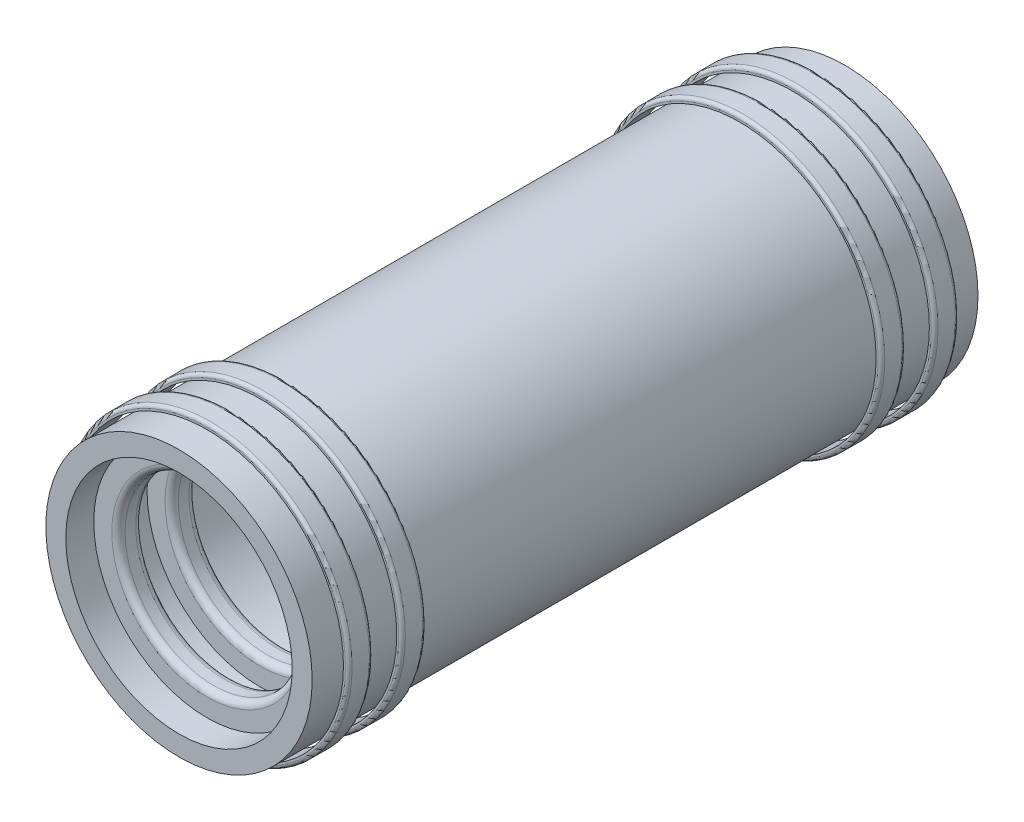
ISO-10303-21;
HEADER;
FILE_DESCRIPTION(('STEP AP214'),'2;1');
FILE_NAME('part.step','',(''),(''),'','','');
FILE_SCHEMA(('AUTOMOTIVE_DESIGN { 1 0 10303 214 1 1 1 1 }'));
ENDSEC;
DATA;
#1=APPLICATION_CONTEXT('core data for automotive mechanical design processes');
#2=APPLICATION_PROTOCOL_DEFINITION('international standard','automotive_design',2000,#1);
#3=PRODUCT_CONTEXT('',#1,'mechanical');
#4=PRODUCT('Part','Part','',(#3));
#5=PRODUCT_RELATED_PRODUCT_CATEGORY('part','',(#4));
#6=PRODUCT_DEFINITION_FORMATION('','',#4);
#7=PRODUCT_DEFINITION_CONTEXT('part definition',#1,'design');
#8=PRODUCT_DEFINITION('design','',#6,#7);
#9=PRODUCT_DEFINITION_SHAPE('','',#8);
#10=(LENGTH_UNIT() NAMED_UNIT(*) SI_UNIT(.MILLI.,.METRE.));
#11=(NAMED_UNIT(*) PLANE_ANGLE_UNIT() SI_UNIT($,.RADIAN.));
#12=(NAMED_UNIT(*) SI_UNIT($,.STERADIAN.) SOLID_ANGLE_UNIT());
#13=UNCERTAINTY_MEASURE_WITH_UNIT(LENGTH_MEASURE(1.E-05),#10,'distance_accuracy_value','');
#14=(GEOMETRIC_REPRESENTATION_CONTEXT(3) GLOBAL_UNCERTAINTY_ASSIGNED_CONTEXT((#13)) GLOBAL_UNIT_ASSIGNED_CONTEXT((#10,
#11,#12)) REPRESENTATION_CONTEXT('',''));
#15=CARTESIAN_POINT('',(0.,0.,0.));
#16=DIRECTION('',(0.,0.,1.));
#17=DIRECTION('',(1.,0.,0.));
#18=AXIS2_PLACEMENT_3D('',#15,#16,#17);
#19=CARTESIAN_POINT('',(0.,0.,100.));
#20=DIRECTION('',(0.,0.,-1.));
#21=DIRECTION('',(-1.,0.,0.));
#22=AXIS2_PLACEMENT_3D('',#19,#20,#21);
#23=CYLINDRICAL_SURFACE('',#22,17.);
#24=CARTESIAN_POINT('',(0.,0.,12.2));
#25=DIRECTION('',(0.,0.,1.));
#26=DIRECTION('',(1.,0.,0.));
#27=AXIS2_PLACEMENT_3D('',#24,#25,#26);
#28=CIRCLE('',#27,17.);
#29=CARTESIAN_POINT('',(17.,0.,12.2));
#30=VERTEX_POINT('',#29);
#31=EDGE_CURVE('E69',#30,#30,#28,.T.);
#32=ORIENTED_EDGE('',*,*,#31,.T.);
#33=EDGE_LOOP('',(#32));
#34=FACE_BOUND('',#33,.T.);
#35=CARTESIAN_POINT('',(0.,0.,7.8));
#36=DIRECTION('',(0.,0.,-1.));
#37=DIRECTION('',(-1.,0.,0.));
#38=AXIS2_PLACEMENT_3D('',#35,#36,#37);
#39=CIRCLE('',#38,17.);
#40=CARTESIAN_POINT('',(-17.,0.,7.8));
#41=VERTEX_POINT('',#40);
#42=EDGE_CURVE('E65',#41,#41,#39,.T.);
#43=ORIENTED_EDGE('',*,*,#42,.T.);
#44=EDGE_LOOP('',(#43));
#45=FACE_BOUND('',#44,.T.);
#46=ADVANCED_FACE('F47',(#34,#45),#23,.F.);
#47=CARTESIAN_POINT('',(0.,0.,84.2));
#48=DIRECTION('',(0.,0.,1.));
#49=DIRECTION('',(1.,0.,0.));
#50=AXIS2_PLACEMENT_3D('',#47,#48,#49);
#51=CIRCLE('',#50,17.);
#52=CARTESIAN_POINT('',(17.,0.,84.2));
#53=VERTEX_POINT('',#52);
#54=EDGE_CURVE('E68',#53,#53,#51,.T.);
#55=ORIENTED_EDGE('',*,*,#54,.T.);
#56=EDGE_LOOP('',(#55));
#57=FACE_BOUND('',#56,.T.);
#58=CARTESIAN_POINT('',(0.,0.,15.8));
#59=DIRECTION('',(0.,0.,-1.));
#60=DIRECTION('',(-1.,0.,0.));
#61=AXIS2_PLACEMENT_3D('',#58,#59,#60);
#62=CIRCLE('',#61,17.);
#63=CARTESIAN_POINT('',(-17.,0.,15.8));
#64=VERTEX_POINT('',#63);
#65=EDGE_CURVE('E72',#64,#64,#62,.T.);
#66=ORIENTED_EDGE('',*,*,#65,.T.);
#67=EDGE_LOOP('',(#66));
#68=FACE_BOUND('',#67,.T.);
#69=ADVANCED_FACE('F141',(#57,#68),#23,.F.);
#70=CARTESIAN_POINT('',(0.,0.,87.8));
#71=DIRECTION('',(0.,0.,-1.));
#72=DIRECTION('',(-1.,0.,0.));
#73=AXIS2_PLACEMENT_3D('',#70,#71,#72);
#74=CIRCLE('',#73,17.);
#75=CARTESIAN_POINT('',(-17.,0.,87.8));
#76=VERTEX_POINT('',#75);
#77=EDGE_CURVE('E75',#76,#76,#74,.T.);
#78=ORIENTED_EDGE('',*,*,#77,.T.);
#79=EDGE_LOOP('',(#78));
#80=FACE_BOUND('',#79,.T.);
#81=CARTESIAN_POINT('',(0.,0.,92.2));
#82=DIRECTION('',(0.,0.,1.));
#83=DIRECTION('',(1.,0.,0.));
#84=AXIS2_PLACEMENT_3D('',#81,#82,#83);
#85=CIRCLE('',#84,17.);
#86=CARTESIAN_POINT('',(17.,0.,92.2));
#87=VERTEX_POINT('',#86);
#88=EDGE_CURVE('E85',#87,#87,#85,.T.);
#89=ORIENTED_EDGE('',*,*,#88,.T.);
#90=EDGE_LOOP('',(#89));
#91=FACE_BOUND('',#90,.T.);
#92=ADVANCED_FACE('F135',(#80,#91),#23,.F.);
#93=CARTESIAN_POINT('',(-21.3,0.,87.8));
#94=DIRECTION('',(0.,0.,-1.));
#95=DIRECTION('',(-1.,0.,0.));
#96=AXIS2_PLACEMENT_3D('',#93,#94,#95);
#97=PLANE('',#96);
#98=CARTESIAN_POINT('',(0.,0.,87.8));
#99=DIRECTION('',(0.,0.,-1.));
#100=DIRECTION('',(-1.,0.,0.));
#101=AXIS2_PLACEMENT_3D('',#98,#99,#100);
#102=CIRCLE('',#101,14.3);
#103=CARTESIAN_POINT('',(-14.3,0.,87.8));
#104=VERTEX_POINT('',#103);
#105=EDGE_CURVE('E81',#104,#104,#102,.T.);
#106=ORIENTED_EDGE('',*,*,#105,.T.);
#107=EDGE_LOOP('',(#106));
#108=FACE_BOUND('',#107,.T.);
#109=ORIENTED_EDGE('',*,*,#77,.F.);
#110=EDGE_LOOP('',(#109));
#111=FACE_BOUND('',#110,.T.);
#112=ADVANCED_FACE('F236',(#108,#111),#97,.F.);
#113=CARTESIAN_POINT('',(0.,0.,100.));
#114=DIRECTION('',(0.,0.,1.));
#115=DIRECTION('',(1.,0.,0.));
#116=AXIS2_PLACEMENT_3D('',#113,#114,#115);
#117=CYLINDRICAL_SURFACE('',#116,13.3);
#118=CARTESIAN_POINT('',(0.,0.,86.8));
#119=DIRECTION('',(0.,0.,-1.));
#120=DIRECTION('',(-1.,0.,0.));
#121=AXIS2_PLACEMENT_3D('',#118,#119,#120);
#122=CIRCLE('',#121,13.3);
#123=CARTESIAN_POINT('',(-13.3,0.,86.8));
#124=VERTEX_POINT('',#123);
#125=EDGE_CURVE('E84',#124,#124,#122,.F.);
#126=ORIENTED_EDGE('',*,*,#125,.T.);
#127=EDGE_LOOP('',(#126));
#128=FACE_BOUND('',#127,.T.);
#129=CARTESIAN_POINT('',(0.,0.,85.2));
#130=DIRECTION('',(0.,0.,1.));
#131=DIRECTION('',(1.,0.,0.));
#132=AXIS2_PLACEMENT_3D('',#129,#130,#131);
#133=CIRCLE('',#132,13.3);
#134=CARTESIAN_POINT('',(13.3,0.,85.2));
#135=VERTEX_POINT('',#134);
#136=EDGE_CURVE('E80',#135,#135,#133,.F.);
#137=ORIENTED_EDGE('',*,*,#136,.T.);
#138=EDGE_LOOP('',(#137));
#139=FACE_BOUND('',#138,.T.);
#140=ADVANCED_FACE('F239',(#128,#139),#117,.F.);
#141=CARTESIAN_POINT('',(-21.3,0.,84.2));
#142=DIRECTION('',(0.,0.,1.));
#143=DIRECTION('',(1.,0.,0.));
#144=AXIS2_PLACEMENT_3D('',#141,#142,#143);
#145=PLANE('',#144);
#146=CARTESIAN_POINT('',(0.,0.,84.2));
#147=DIRECTION('',(0.,0.,1.));
#148=DIRECTION('',(1.,0.,0.));
#149=AXIS2_PLACEMENT_3D('',#146,#147,#148);
#150=CIRCLE('',#149,14.3);
#151=CARTESIAN_POINT('',(14.3,0.,84.2));
#152=VERTEX_POINT('',#151);
#153=EDGE_CURVE('E76',#152,#152,#150,.T.);
#154=ORIENTED_EDGE('',*,*,#153,.T.);
#155=EDGE_LOOP('',(#154));
#156=FACE_BOUND('',#155,.T.);
#157=ORIENTED_EDGE('',*,*,#54,.F.);
#158=EDGE_LOOP('',(#157));
#159=FACE_BOUND('',#158,.T.);
#160=ADVANCED_FACE('F241',(#156,#159),#145,.F.);
#161=CARTESIAN_POINT('',(-21.3,0.,95.8));
#162=DIRECTION('',(0.,0.,-1.));
#163=DIRECTION('',(-1.,0.,0.));
#164=AXIS2_PLACEMENT_3D('',#161,#162,#163);
#165=PLANE('',#164);
#166=CARTESIAN_POINT('',(0.,0.,95.8));
#167=DIRECTION('',(0.,0.,-1.));
#168=DIRECTION('',(-1.,0.,0.));
#169=AXIS2_PLACEMENT_3D('',#166,#167,#168);
#170=CIRCLE('',#169,14.3);
#171=CARTESIAN_POINT('',(-14.3,0.,95.8));
#172=VERTEX_POINT('',#171);
#173=EDGE_CURVE('E79',#172,#172,#170,.T.);
#174=ORIENTED_EDGE('',*,*,#173,.T.);
#175=EDGE_LOOP('',(#174));
#176=FACE_BOUND('',#175,.T.);
#177=CARTESIAN_POINT('',(0.,0.,95.8));
#178=DIRECTION('',(0.,0.,-1.));
#179=DIRECTION('',(-1.,0.,0.));
#180=AXIS2_PLACEMENT_3D('',#177,#178,#179);
#181=CIRCLE('',#180,17.);
#182=CARTESIAN_POINT('',(-17.,0.,95.8));
#183=VERTEX_POINT('',#182);
#184=EDGE_CURVE('E102',#183,#183,#181,.T.);
#185=ORIENTED_EDGE('',*,*,#184,.F.);
#186=EDGE_LOOP('',(#185));
#187=FACE_BOUND('',#186,.T.);
#188=ADVANCED_FACE('F244',(#176,#187),#165,.F.);
#189=CARTESIAN_POINT('',(0.,0.,100.));
#190=DIRECTION('',(0.,0.,1.));
#191=DIRECTION('',(1.,0.,0.));
#192=AXIS2_PLACEMENT_3D('',#189,#190,#191);
#193=CYLINDRICAL_SURFACE('',#192,13.3);
#194=CARTESIAN_POINT('',(0.,0.,94.8));
#195=DIRECTION('',(0.,0.,-1.));
#196=DIRECTION('',(-1.,0.,0.));
#197=AXIS2_PLACEMENT_3D('',#194,#195,#196);
#198=CIRCLE('',#197,13.3);
#199=CARTESIAN_POINT('',(-13.3,0.,94.8));
#200=VERTEX_POINT('',#199);
#201=EDGE_CURVE('E97',#200,#200,#198,.F.);
#202=ORIENTED_EDGE('',*,*,#201,.T.);
#203=EDGE_LOOP('',(#202));
#204=FACE_BOUND('',#203,.T.);
#205=CARTESIAN_POINT('',(0.,0.,93.2));
#206=DIRECTION('',(0.,0.,1.));
#207=DIRECTION('',(1.,0.,0.));
#208=AXIS2_PLACEMENT_3D('',#205,#206,#207);
#209=CIRCLE('',#208,13.3);
#210=CARTESIAN_POINT('',(13.3,0.,93.2));
#211=VERTEX_POINT('',#210);
#212=EDGE_CURVE('E94',#211,#211,#209,.F.);
#213=ORIENTED_EDGE('',*,*,#212,.T.);
#214=EDGE_LOOP('',(#213));
#215=FACE_BOUND('',#214,.T.);
#216=ADVANCED_FACE('F248',(#204,#215),#193,.F.);
#217=CARTESIAN_POINT('',(-21.3,0.,92.2));
#218=DIRECTION('',(0.,0.,1.));
#219=DIRECTION('',(1.,0.,0.));
#220=AXIS2_PLACEMENT_3D('',#217,#218,#219);
#221=PLANE('',#220);
#222=CARTESIAN_POINT('',(0.,0.,92.2));
#223=DIRECTION('',(0.,0.,1.));
#224=DIRECTION('',(1.,0.,0.));
#225=AXIS2_PLACEMENT_3D('',#222,#223,#224);
#226=CIRCLE('',#225,14.3);
#227=CARTESIAN_POINT('',(14.3,0.,92.2));
#228=VERTEX_POINT('',#227);
#229=EDGE_CURVE('E90',#228,#228,#226,.T.);
#230=ORIENTED_EDGE('',*,*,#229,.T.);
#231=EDGE_LOOP('',(#230));
#232=FACE_BOUND('',#231,.T.);
#233=ORIENTED_EDGE('',*,*,#88,.F.);
#234=EDGE_LOOP('',(#233));
#235=FACE_BOUND('',#234,.T.);
#236=ADVANCED_FACE('F136',(#232,#235),#221,.F.);
#237=CARTESIAN_POINT('',(0.,0.,100.));
#238=DIRECTION('',(0.,0.,-1.));
#239=DIRECTION('',(-1.,0.,0.));
#240=AXIS2_PLACEMENT_3D('',#237,#238,#239);
#241=CYLINDRICAL_SURFACE('',#240,20.);
#242=CARTESIAN_POINT('',(0.,0.,100.));
#243=DIRECTION('',(0.,0.,1.));
#244=DIRECTION('',(1.,0.,0.));
#245=AXIS2_PLACEMENT_3D('',#242,#243,#244);
#246=CIRCLE('',#245,20.);
#247=CARTESIAN_POINT('',(20.,0.,100.));
#248=VERTEX_POINT('',#247);
#249=EDGE_CURVE('E93',#248,#248,#246,.T.);
#250=ORIENTED_EDGE('',*,*,#249,.F.);
#251=EDGE_LOOP('',(#250));
#252=FACE_BOUND('',#251,.T.);
#253=CARTESIAN_POINT('',(0.,0.,0.));
#254=DIRECTION('',(0.,0.,1.));
#255=DIRECTION('',(1.,0.,0.));
#256=AXIS2_PLACEMENT_3D('',#253,#254,#255);
#257=CIRCLE('',#256,20.);
#258=CARTESIAN_POINT('',(20.,0.,0.));
#259=VERTEX_POINT('',#258);
#260=EDGE_CURVE('E60',#259,#259,#257,.T.);
#261=ORIENTED_EDGE('',*,*,#260,.T.);
#262=EDGE_LOOP('',(#261));
#263=FACE_BOUND('',#262,.T.);
#264=ADVANCED_FACE('F126',(#252,#263),#241,.T.);
#265=CARTESIAN_POINT('',(0.,0.,100.));
#266=DIRECTION('',(0.,0.,1.));
#267=DIRECTION('',(1.,0.,0.));
#268=AXIS2_PLACEMENT_3D('',#265,#266,#267);
#269=PLANE('',#268);
#270=ORIENTED_EDGE('',*,*,#249,.T.);
#271=EDGE_LOOP('',(#270));
#272=FACE_BOUND('',#271,.T.);
#273=CARTESIAN_POINT('',(0.,0.,100.));
#274=DIRECTION('',(0.,0.,1.));
#275=DIRECTION('',(1.,0.,0.));
#276=AXIS2_PLACEMENT_3D('',#273,#274,#275);
#277=CIRCLE('',#276,17.);
#278=CARTESIAN_POINT('',(17.,0.,100.));
#279=VERTEX_POINT('',#278);
#280=EDGE_CURVE('E51',#279,#279,#277,.T.);
#281=ORIENTED_EDGE('',*,*,#280,.F.);
#282=EDGE_LOOP('',(#281));
#283=FACE_BOUND('',#282,.T.);
#284=ADVANCED_FACE('F124',(#272,#283),#269,.T.);
#285=ORIENTED_EDGE('',*,*,#280,.T.);
#286=EDGE_LOOP('',(#285));
#287=FACE_BOUND('',#286,.T.);
#288=ORIENTED_EDGE('',*,*,#184,.T.);
#289=EDGE_LOOP('',(#288));
#290=FACE_BOUND('',#289,.T.);
#291=ADVANCED_FACE('F121',(#287,#290),#23,.F.);
#292=CARTESIAN_POINT('',(0.,0.,94.8));
#293=DIRECTION('',(0.,0.,-1.));
#294=DIRECTION('',(-1.,0.,0.));
#295=AXIS2_PLACEMENT_3D('',#292,#293,#294);
#296=TOROIDAL_SURFACE('',#295,14.3,1.);
#297=ORIENTED_EDGE('',*,*,#173,.F.);
#298=EDGE_LOOP('',(#297));
#299=FACE_BOUND('',#298,.T.);
#300=ORIENTED_EDGE('',*,*,#201,.F.);
#301=EDGE_LOOP('',(#300));
#302=FACE_BOUND('',#301,.T.);
#303=ADVANCED_FACE('F132',(#299,#302),#296,.T.);
#304=CARTESIAN_POINT('',(0.,0.,93.2));
#305=DIRECTION('',(0.,0.,1.));
#306=DIRECTION('',(1.,0.,0.));
#307=AXIS2_PLACEMENT_3D('',#304,#305,#306);
#308=TOROIDAL_SURFACE('',#307,14.3,1.);
#309=ORIENTED_EDGE('',*,*,#212,.F.);
#310=EDGE_LOOP('',(#309));
#311=FACE_BOUND('',#310,.T.);
#312=ORIENTED_EDGE('',*,*,#229,.F.);
#313=EDGE_LOOP('',(#312));
#314=FACE_BOUND('',#313,.T.);
#315=ADVANCED_FACE('F172',(#311,#314),#308,.T.);
#316=CARTESIAN_POINT('',(0.,0.,86.8));
#317=DIRECTION('',(0.,0.,-1.));
#318=DIRECTION('',(-1.,0.,0.));
#319=AXIS2_PLACEMENT_3D('',#316,#317,#318);
#320=TOROIDAL_SURFACE('',#319,14.3,1.);
#321=ORIENTED_EDGE('',*,*,#105,.F.);
#322=EDGE_LOOP('',(#321));
#323=FACE_BOUND('',#322,.T.);
#324=ORIENTED_EDGE('',*,*,#125,.F.);
#325=EDGE_LOOP('',(#324));
#326=FACE_BOUND('',#325,.T.);
#327=ADVANCED_FACE('F176',(#323,#326),#320,.T.);
#328=CARTESIAN_POINT('',(0.,0.,85.2));
#329=DIRECTION('',(0.,0.,1.));
#330=DIRECTION('',(1.,0.,0.));
#331=AXIS2_PLACEMENT_3D('',#328,#329,#330);
#332=TOROIDAL_SURFACE('',#331,14.3,1.);
#333=ORIENTED_EDGE('',*,*,#136,.F.);
#334=EDGE_LOOP('',(#333));
#335=FACE_BOUND('',#334,.T.);
#336=ORIENTED_EDGE('',*,*,#153,.F.);
#337=EDGE_LOOP('',(#336));
#338=FACE_BOUND('',#337,.T.);
#339=ADVANCED_FACE('F180',(#335,#338),#332,.T.);
#340=CARTESIAN_POINT('',(-21.3,0.,12.2));
#341=DIRECTION('',(0.,0.,1.));
#342=DIRECTION('',(-1.,0.,0.));
#343=AXIS2_PLACEMENT_3D('',#340,#341,#342);
#344=PLANE('',#343);
#345=CARTESIAN_POINT('',(0.,0.,12.2));
#346=DIRECTION('',(0.,0.,1.));
#347=DIRECTION('',(1.,0.,0.));
#348=AXIS2_PLACEMENT_3D('',#345,#346,#347);
#349=CIRCLE('',#348,14.3);
#350=CARTESIAN_POINT('',(14.3,0.,12.2));
#351=VERTEX_POINT('',#350);
#352=EDGE_CURVE('E105',#351,#351,#349,.T.);
#353=ORIENTED_EDGE('',*,*,#352,.T.);
#354=EDGE_LOOP('',(#353));
#355=FACE_BOUND('',#354,.T.);
#356=ORIENTED_EDGE('',*,*,#31,.F.);
#357=EDGE_LOOP('',(#356));
#358=FACE_BOUND('',#357,.T.);
#359=ADVANCED_FACE('F183',(#355,#358),#344,.F.);
#360=CARTESIAN_POINT('',(0.,0.,0.));
#361=DIRECTION('',(0.,0.,-1.));
#362=DIRECTION('',(1.,0.,0.));
#363=AXIS2_PLACEMENT_3D('',#360,#361,#362);
#364=CYLINDRICAL_SURFACE('',#363,13.3);
#365=CARTESIAN_POINT('',(0.,0.,13.2));
#366=DIRECTION('',(0.,0.,1.));
#367=DIRECTION('',(1.,0.,0.));
#368=AXIS2_PLACEMENT_3D('',#365,#366,#367);
#369=CIRCLE('',#368,13.3);
#370=CARTESIAN_POINT('',(13.3,0.,13.2));
#371=VERTEX_POINT('',#370);
#372=EDGE_CURVE('E206',#371,#371,#369,.F.);
#373=ORIENTED_EDGE('',*,*,#372,.T.);
#374=EDGE_LOOP('',(#373));
#375=FACE_BOUND('',#374,.T.);
#376=CARTESIAN_POINT('',(0.,0.,14.8));
#377=DIRECTION('',(0.,0.,-1.));
#378=DIRECTION('',(-1.,0.,0.));
#379=AXIS2_PLACEMENT_3D('',#376,#377,#378);
#380=CIRCLE('',#379,13.3);
#381=CARTESIAN_POINT('',(-13.3,0.,14.8));
#382=VERTEX_POINT('',#381);
#383=EDGE_CURVE('E204',#382,#382,#380,.F.);
#384=ORIENTED_EDGE('',*,*,#383,.T.);
#385=EDGE_LOOP('',(#384));
#386=FACE_BOUND('',#385,.T.);
#387=ADVANCED_FACE('F234',(#375,#386),#364,.F.);
#388=CARTESIAN_POINT('',(-21.3,0.,15.8));
#389=DIRECTION('',(0.,0.,-1.));
#390=DIRECTION('',(1.,0.,0.));
#391=AXIS2_PLACEMENT_3D('',#388,#389,#390);
#392=PLANE('',#391);
#393=CARTESIAN_POINT('',(0.,0.,15.8));
#394=DIRECTION('',(0.,0.,-1.));
#395=DIRECTION('',(-1.,0.,0.));
#396=AXIS2_PLACEMENT_3D('',#393,#394,#395);
#397=CIRCLE('',#396,14.3);
#398=CARTESIAN_POINT('',(-14.3,0.,15.8));
#399=VERTEX_POINT('',#398);
#400=EDGE_CURVE('E201',#399,#399,#397,.T.);
#401=ORIENTED_EDGE('',*,*,#400,.T.);
#402=EDGE_LOOP('',(#401));
#403=FACE_BOUND('',#402,.T.);
#404=ORIENTED_EDGE('',*,*,#65,.F.);
#405=EDGE_LOOP('',(#404));
#406=FACE_BOUND('',#405,.T.);
#407=ADVANCED_FACE('F230',(#403,#406),#392,.F.);
#408=CARTESIAN_POINT('',(-21.3,0.,4.20000000000001));
#409=DIRECTION('',(0.,0.,1.));
#410=DIRECTION('',(-1.,0.,0.));
#411=AXIS2_PLACEMENT_3D('',#408,#409,#410);
#412=PLANE('',#411);
#413=CARTESIAN_POINT('',(0.,0.,4.20000000000001));
#414=DIRECTION('',(0.,0.,1.));
#415=DIRECTION('',(1.,0.,0.));
#416=AXIS2_PLACEMENT_3D('',#413,#414,#415);
#417=CIRCLE('',#416,14.3);
#418=CARTESIAN_POINT('',(14.3,0.,4.20000000000001));
#419=VERTEX_POINT('',#418);
#420=EDGE_CURVE('E63',#419,#419,#417,.T.);
#421=ORIENTED_EDGE('',*,*,#420,.T.);
#422=EDGE_LOOP('',(#421));
#423=FACE_BOUND('',#422,.T.);
#424=CARTESIAN_POINT('',(0.,0.,4.20000000000001));
#425=DIRECTION('',(0.,0.,1.));
#426=DIRECTION('',(1.,0.,0.));
#427=AXIS2_PLACEMENT_3D('',#424,#425,#426);
#428=CIRCLE('',#427,17.);
#429=CARTESIAN_POINT('',(17.,0.,4.20000000000001));
#430=VERTEX_POINT('',#429);
#431=EDGE_CURVE('E11',#430,#430,#428,.T.);
#432=ORIENTED_EDGE('',*,*,#431,.F.);
#433=EDGE_LOOP('',(#432));
#434=FACE_BOUND('',#433,.T.);
#435=ADVANCED_FACE('F224',(#423,#434),#412,.F.);
#436=CARTESIAN_POINT('',(0.,0.,0.));
#437=DIRECTION('',(0.,0.,-1.));
#438=DIRECTION('',(1.,0.,0.));
#439=AXIS2_PLACEMENT_3D('',#436,#437,#438);
#440=CYLINDRICAL_SURFACE('',#439,13.3);
#441=CARTESIAN_POINT('',(0.,0.,5.20000000000001));
#442=DIRECTION('',(0.,0.,1.));
#443=DIRECTION('',(1.,0.,0.));
#444=AXIS2_PLACEMENT_3D('',#441,#442,#443);
#445=CIRCLE('',#444,13.3);
#446=CARTESIAN_POINT('',(13.3,0.,5.20000000000001));
#447=VERTEX_POINT('',#446);
#448=EDGE_CURVE('E217',#447,#447,#445,.F.);
#449=ORIENTED_EDGE('',*,*,#448,.T.);
#450=EDGE_LOOP('',(#449));
#451=FACE_BOUND('',#450,.T.);
#452=CARTESIAN_POINT('',(0.,0.,6.8));
#453=DIRECTION('',(0.,0.,-1.));
#454=DIRECTION('',(-1.,0.,0.));
#455=AXIS2_PLACEMENT_3D('',#452,#453,#454);
#456=CIRCLE('',#455,13.3);
#457=CARTESIAN_POINT('',(-13.3,0.,6.8));
#458=VERTEX_POINT('',#457);
#459=EDGE_CURVE('E216',#458,#458,#456,.F.);
#460=ORIENTED_EDGE('',*,*,#459,.T.);
#461=EDGE_LOOP('',(#460));
#462=FACE_BOUND('',#461,.T.);
#463=ADVANCED_FACE('F166',(#451,#462),#440,.F.);
#464=CARTESIAN_POINT('',(-21.3,0.,7.8));
#465=DIRECTION('',(0.,0.,-1.));
#466=DIRECTION('',(1.,0.,0.));
#467=AXIS2_PLACEMENT_3D('',#464,#465,#466);
#468=PLANE('',#467);
#469=CARTESIAN_POINT('',(0.,0.,7.8));
#470=DIRECTION('',(0.,0.,-1.));
#471=DIRECTION('',(-1.,0.,0.));
#472=AXIS2_PLACEMENT_3D('',#469,#470,#471);
#473=CIRCLE('',#472,14.3);
#474=CARTESIAN_POINT('',(-14.3,0.,7.8));
#475=VERTEX_POINT('',#474);
#476=EDGE_CURVE('E114',#475,#475,#473,.T.);
#477=ORIENTED_EDGE('',*,*,#476,.T.);
#478=EDGE_LOOP('',(#477));
#479=FACE_BOUND('',#478,.T.);
#480=ORIENTED_EDGE('',*,*,#42,.F.);
#481=EDGE_LOOP('',(#480));
#482=FACE_BOUND('',#481,.T.);
#483=ADVANCED_FACE('F49',(#479,#482),#468,.F.);
#484=CARTESIAN_POINT('',(0.,0.,0.));
#485=DIRECTION('',(0.,0.,1.));
#486=DIRECTION('',(1.,0.,0.));
#487=AXIS2_PLACEMENT_3D('',#484,#485,#486);
#488=PLANE('',#487);
#489=ORIENTED_EDGE('',*,*,#260,.F.);
#490=EDGE_LOOP('',(#489));
#491=FACE_BOUND('',#490,.T.);
#492=CARTESIAN_POINT('',(0.,0.,0.));
#493=DIRECTION('',(0.,0.,1.));
#494=DIRECTION('',(1.,0.,0.));
#495=AXIS2_PLACEMENT_3D('',#492,#493,#494);
#496=CIRCLE('',#495,17.);
#497=CARTESIAN_POINT('',(17.,0.,0.));
#498=VERTEX_POINT('',#497);
#499=EDGE_CURVE('E55',#498,#498,#496,.T.);
#500=ORIENTED_EDGE('',*,*,#499,.T.);
#501=EDGE_LOOP('',(#500));
#502=FACE_BOUND('',#501,.T.);
#503=ADVANCED_FACE('F151',(#491,#502),#488,.F.);
#504=ORIENTED_EDGE('',*,*,#499,.F.);
#505=EDGE_LOOP('',(#504));
#506=FACE_BOUND('',#505,.T.);
#507=ORIENTED_EDGE('',*,*,#431,.T.);
#508=EDGE_LOOP('',(#507));
#509=FACE_BOUND('',#508,.T.);
#510=ADVANCED_FACE('F134',(#506,#509),#23,.F.);
#511=CARTESIAN_POINT('',(0.,0.,5.20000000000001));
#512=DIRECTION('',(0.,0.,1.));
#513=DIRECTION('',(1.,0.,0.));
#514=AXIS2_PLACEMENT_3D('',#511,#512,#513);
#515=TOROIDAL_SURFACE('',#514,14.3,1.);
#516=ORIENTED_EDGE('',*,*,#448,.F.);
#517=EDGE_LOOP('',(#516));
#518=FACE_BOUND('',#517,.T.);
#519=ORIENTED_EDGE('',*,*,#420,.F.);
#520=EDGE_LOOP('',(#519));
#521=FACE_BOUND('',#520,.T.);
#522=ADVANCED_FACE('F150',(#518,#521),#515,.T.);
#523=CARTESIAN_POINT('',(0.,0.,6.8));
#524=DIRECTION('',(0.,0.,-1.));
#525=DIRECTION('',(-1.,0.,0.));
#526=AXIS2_PLACEMENT_3D('',#523,#524,#525);
#527=TOROIDAL_SURFACE('',#526,14.3,1.);
#528=ORIENTED_EDGE('',*,*,#476,.F.);
#529=EDGE_LOOP('',(#528));
#530=FACE_BOUND('',#529,.T.);
#531=ORIENTED_EDGE('',*,*,#459,.F.);
#532=EDGE_LOOP('',(#531));
#533=FACE_BOUND('',#532,.T.);
#534=ADVANCED_FACE('F157',(#530,#533),#527,.T.);
#535=CARTESIAN_POINT('',(0.,0.,13.2));
#536=DIRECTION('',(0.,0.,1.));
#537=DIRECTION('',(1.,0.,0.));
#538=AXIS2_PLACEMENT_3D('',#535,#536,#537);
#539=TOROIDAL_SURFACE('',#538,14.3,1.);
#540=ORIENTED_EDGE('',*,*,#372,.F.);
#541=EDGE_LOOP('',(#540));
#542=FACE_BOUND('',#541,.T.);
#543=ORIENTED_EDGE('',*,*,#352,.F.);
#544=EDGE_LOOP('',(#543));
#545=FACE_BOUND('',#544,.T.);
#546=ADVANCED_FACE('F188',(#542,#545),#539,.T.);
#547=CARTESIAN_POINT('',(0.,0.,14.8));
#548=DIRECTION('',(0.,0.,-1.));
#549=DIRECTION('',(-1.,0.,0.));
#550=AXIS2_PLACEMENT_3D('',#547,#548,#549);
#551=TOROIDAL_SURFACE('',#550,14.3,1.);
#552=ORIENTED_EDGE('',*,*,#400,.F.);
#553=EDGE_LOOP('',(#552));
#554=FACE_BOUND('',#553,.T.);
#555=ORIENTED_EDGE('',*,*,#383,.F.);
#556=EDGE_LOOP('',(#555));
#557=FACE_BOUND('',#556,.T.);
#558=ADVANCED_FACE('F192',(#554,#557),#551,.T.);
#559=CLOSED_SHELL('',(#46,#69,#92,#112,#140,#160,#188,#216,#236,#264,#284,#291,#303,#315,#327,
#339,#359,#387,#407,#435,#463,#483,#503,#510,#522,#534,#546,#558));
#560=MANIFOLD_SOLID_BREP('B2',#559);
#561=CARTESIAN_POINT('',(0.,0.,4.70000000000001));
#562=DIRECTION('',(0.,0.,1.));
#563=DIRECTION('',(1.,0.,0.));
#564=AXIS2_PLACEMENT_3D('',#561,#562,#563);
#565=TOROIDAL_SURFACE('',#564,20.8,0.5);
#566=CARTESIAN_POINT('',(0.,0.,4.20000000000001));
#567=DIRECTION('',(0.,0.,1.));
#568=DIRECTION('',(1.,0.,0.));
#569=AXIS2_PLACEMENT_3D('',#566,#567,#568);
#570=CIRCLE('',#569,20.8);
#571=CARTESIAN_POINT('',(20.8,0.,4.20000000000001));
#572=VERTEX_POINT('',#571);
#573=EDGE_CURVE('E521',#572,#572,#570,.F.);
#574=ORIENTED_EDGE('',*,*,#573,.F.);
#575=EDGE_LOOP('',(#574));
#576=FACE_BOUND('',#575,.T.);
#577=CARTESIAN_POINT('',(0.,0.,4.70000000000001));
#578=DIRECTION('',(0.,0.,1.));
#579=DIRECTION('',(1.,0.,0.));
#580=AXIS2_PLACEMENT_3D('',#577,#578,#579);
#581=CIRCLE('',#580,21.3);
#582=CARTESIAN_POINT('',(21.3,0.,4.70000000000001));
#583=VERTEX_POINT('',#582);
#584=EDGE_CURVE('E513',#583,#583,#581,.T.);
#585=ORIENTED_EDGE('',*,*,#584,.F.);
#586=EDGE_LOOP('',(#585));
#587=FACE_BOUND('',#586,.T.);
#588=ADVANCED_FACE('F501',(#576,#587),#565,.T.);
#589=CARTESIAN_POINT('',(-21.3,0.,4.20000000000001));
#590=DIRECTION('',(0.,0.,1.));
#591=DIRECTION('',(-1.,0.,0.));
#592=AXIS2_PLACEMENT_3D('',#589,#590,#591);
#593=PLANE('',#592);
#594=CARTESIAN_POINT('',(0.,0.,4.20000000000001));
#595=DIRECTION('',(0.,0.,1.));
#596=DIRECTION('',(1.,0.,0.));
#597=AXIS2_PLACEMENT_3D('',#594,#595,#596);
#598=CIRCLE('',#597,20.5);
#599=CARTESIAN_POINT('',(20.5,0.,4.20000000000001));
#600=VERTEX_POINT('',#599);
#601=EDGE_CURVE('E505',#600,#600,#598,.T.);
#602=ORIENTED_EDGE('',*,*,#601,.T.);
#603=EDGE_LOOP('',(#602));
#604=FACE_BOUND('',#603,.T.);
#605=ORIENTED_EDGE('',*,*,#573,.T.);
#606=EDGE_LOOP('',(#605));
#607=FACE_BOUND('',#606,.T.);
#608=ADVANCED_FACE('F528',(#604,#607),#593,.F.);
#609=CARTESIAN_POINT('',(0.,0.,0.));
#610=DIRECTION('',(0.,0.,-1.));
#611=DIRECTION('',(1.,0.,0.));
#612=AXIS2_PLACEMENT_3D('',#609,#610,#611);
#613=CYLINDRICAL_SURFACE('',#612,21.3);
#614=CARTESIAN_POINT('',(0.,0.,7.3));
#615=DIRECTION('',(0.,0.,-1.));
#616=DIRECTION('',(-1.,0.,0.));
#617=AXIS2_PLACEMENT_3D('',#614,#615,#616);
#618=CIRCLE('',#617,21.3);
#619=CARTESIAN_POINT('',(-21.3,0.,7.3));
#620=VERTEX_POINT('',#619);
#621=EDGE_CURVE('E518',#620,#620,#618,.T.);
#622=ORIENTED_EDGE('',*,*,#621,.T.);
#623=EDGE_LOOP('',(#622));
#624=FACE_BOUND('',#623,.T.);
#625=ORIENTED_EDGE('',*,*,#584,.T.);
#626=EDGE_LOOP('',(#625));
#627=FACE_BOUND('',#626,.T.);
#628=ADVANCED_FACE('F545',(#624,#627),#613,.T.);
#629=CARTESIAN_POINT('',(0.,0.,7.3));
#630=DIRECTION('',(0.,0.,-1.));
#631=DIRECTION('',(-1.,0.,0.));
#632=AXIS2_PLACEMENT_3D('',#629,#630,#631);
#633=TOROIDAL_SURFACE('',#632,20.8,0.5);
#634=ORIENTED_EDGE('',*,*,#621,.F.);
#635=EDGE_LOOP('',(#634));
#636=FACE_BOUND('',#635,.T.);
#637=CARTESIAN_POINT('',(0.,0.,7.8));
#638=DIRECTION('',(0.,0.,-1.));
#639=DIRECTION('',(-1.,0.,0.));
#640=AXIS2_PLACEMENT_3D('',#637,#638,#639);
#641=CIRCLE('',#640,20.8);
#642=CARTESIAN_POINT('',(-20.8,0.,7.8));
#643=VERTEX_POINT('',#642);
#644=EDGE_CURVE('E46',#643,#643,#641,.F.);
#645=ORIENTED_EDGE('',*,*,#644,.F.);
#646=EDGE_LOOP('',(#645));
#647=FACE_BOUND('',#646,.T.);
#648=ADVANCED_FACE('F536',(#636,#647),#633,.T.);
#649=CARTESIAN_POINT('',(-21.3,0.,7.8));
#650=DIRECTION('',(0.,0.,-1.));
#651=DIRECTION('',(1.,0.,0.));
#652=AXIS2_PLACEMENT_3D('',#649,#650,#651);
#653=PLANE('',#652);
#654=CARTESIAN_POINT('',(0.,0.,7.8));
#655=DIRECTION('',(0.,0.,-1.));
#656=DIRECTION('',(-1.,0.,0.));
#657=AXIS2_PLACEMENT_3D('',#654,#655,#656);
#658=CIRCLE('',#657,20.5);
#659=CARTESIAN_POINT('',(-20.5,0.,7.8));
#660=VERTEX_POINT('',#659);
#661=EDGE_CURVE('E509',#660,#660,#658,.T.);
#662=ORIENTED_EDGE('',*,*,#661,.T.);
#663=EDGE_LOOP('',(#662));
#664=FACE_BOUND('',#663,.T.);
#665=ORIENTED_EDGE('',*,*,#644,.T.);
#666=EDGE_LOOP('',(#665));
#667=FACE_BOUND('',#666,.T.);
#668=ADVANCED_FACE('F531',(#664,#667),#653,.F.);
#669=CARTESIAN_POINT('',(0.,0.,100.));
#670=DIRECTION('',(0.,0.,-1.));
#671=DIRECTION('',(-1.,0.,0.));
#672=AXIS2_PLACEMENT_3D('',#669,#670,#671);
#673=CYLINDRICAL_SURFACE('',#672,20.5);
#674=ORIENTED_EDGE('',*,*,#661,.F.);
#675=EDGE_LOOP('',(#674));
#676=FACE_BOUND('',#675,.T.);
#677=ORIENTED_EDGE('',*,*,#601,.F.);
#678=EDGE_LOOP('',(#677));
#679=FACE_BOUND('',#678,.T.);
#680=ADVANCED_FACE('F503',(#676,#679),#673,.F.);
#681=CLOSED_SHELL('',(#588,#608,#628,#648,#668,#680));
#682=MANIFOLD_SOLID_BREP('B6',#681);
#683=CARTESIAN_POINT('',(0.,0.,12.7));
#684=DIRECTION('',(0.,0.,1.));
#685=DIRECTION('',(1.,0.,0.));
#686=AXIS2_PLACEMENT_3D('',#683,#684,#685);
#687=TOROIDAL_SURFACE('',#686,20.8,0.5);
#688=CARTESIAN_POINT('',(0.,0.,12.2));
#689=DIRECTION('',(0.,0.,1.));
#690=DIRECTION('',(1.,0.,0.));
#691=AXIS2_PLACEMENT_3D('',#688,#689,#690);
#692=CIRCLE('',#691,20.8);
#693=CARTESIAN_POINT('',(20.8,0.,12.2));
#694=VERTEX_POINT('',#693);
#695=EDGE_CURVE('E623',#694,#694,#692,.F.);
#696=ORIENTED_EDGE('',*,*,#695,.F.);
#697=EDGE_LOOP('',(#696));
#698=FACE_BOUND('',#697,.T.);
#699=CARTESIAN_POINT('',(0.,0.,12.7));
#700=DIRECTION('',(0.,0.,1.));
#701=DIRECTION('',(1.,0.,0.));
#702=AXIS2_PLACEMENT_3D('',#699,#700,#701);
#703=CIRCLE('',#702,21.3);
#704=CARTESIAN_POINT('',(21.3,0.,12.7));
#705=VERTEX_POINT('',#704);
#706=EDGE_CURVE('E618',#705,#705,#703,.T.);
#707=ORIENTED_EDGE('',*,*,#706,.F.);
#708=EDGE_LOOP('',(#707));
#709=FACE_BOUND('',#708,.T.);
#710=ADVANCED_FACE('F606',(#698,#709),#687,.T.);
#711=CARTESIAN_POINT('',(-21.3,0.,12.2));
#712=DIRECTION('',(0.,0.,1.));
#713=DIRECTION('',(-1.,0.,0.));
#714=AXIS2_PLACEMENT_3D('',#711,#712,#713);
#715=PLANE('',#714);
#716=CARTESIAN_POINT('',(0.,0.,12.2));
#717=DIRECTION('',(0.,0.,1.));
#718=DIRECTION('',(1.,0.,0.));
#719=AXIS2_PLACEMENT_3D('',#716,#717,#718);
#720=CIRCLE('',#719,20.5);
#721=CARTESIAN_POINT('',(20.5,0.,12.2));
#722=VERTEX_POINT('',#721);
#723=EDGE_CURVE('E621',#722,#722,#720,.T.);
#724=ORIENTED_EDGE('',*,*,#723,.T.);
#725=EDGE_LOOP('',(#724));
#726=FACE_BOUND('',#725,.T.);
#727=ORIENTED_EDGE('',*,*,#695,.T.);
#728=EDGE_LOOP('',(#727));
#729=FACE_BOUND('',#728,.T.);
#730=ADVANCED_FACE('F640',(#726,#729),#715,.F.);
#731=CARTESIAN_POINT('',(0.,0.,0.));
#732=DIRECTION('',(0.,0.,-1.));
#733=DIRECTION('',(1.,0.,0.));
#734=AXIS2_PLACEMENT_3D('',#731,#732,#733);
#735=CYLINDRICAL_SURFACE('',#734,21.3);
#736=CARTESIAN_POINT('',(0.,0.,15.3));
#737=DIRECTION('',(0.,0.,-1.));
#738=DIRECTION('',(-1.,0.,0.));
#739=AXIS2_PLACEMENT_3D('',#736,#737,#738);
#740=CIRCLE('',#739,21.3);
#741=CARTESIAN_POINT('',(-21.3,0.,15.3));
#742=VERTEX_POINT('',#741);
#743=EDGE_CURVE('E627',#742,#742,#740,.T.);
#744=ORIENTED_EDGE('',*,*,#743,.T.);
#745=EDGE_LOOP('',(#744));
#746=FACE_BOUND('',#745,.T.);
#747=ORIENTED_EDGE('',*,*,#706,.T.);
#748=EDGE_LOOP('',(#747));
#749=FACE_BOUND('',#748,.T.);
#750=ADVANCED_FACE('F637',(#746,#749),#735,.T.);
#751=CARTESIAN_POINT('',(0.,0.,15.3));
#752=DIRECTION('',(0.,0.,-1.));
#753=DIRECTION('',(-1.,0.,0.));
#754=AXIS2_PLACEMENT_3D('',#751,#752,#753);
#755=TOROIDAL_SURFACE('',#754,20.8,0.5);
#756=ORIENTED_EDGE('',*,*,#743,.F.);
#757=EDGE_LOOP('',(#756));
#758=FACE_BOUND('',#757,.T.);
#759=CARTESIAN_POINT('',(0.,0.,15.8));
#760=DIRECTION('',(0.,0.,-1.));
#761=DIRECTION('',(-1.,0.,0.));
#762=AXIS2_PLACEMENT_3D('',#759,#760,#761);
#763=CIRCLE('',#762,20.8);
#764=CARTESIAN_POINT('',(-20.8,0.,15.8));
#765=VERTEX_POINT('',#764);
#766=EDGE_CURVE('E500',#765,#765,#763,.F.);
#767=ORIENTED_EDGE('',*,*,#766,.F.);
#768=EDGE_LOOP('',(#767));
#769=FACE_BOUND('',#768,.T.);
#770=ADVANCED_FACE('F648',(#758,#769),#755,.T.);
#771=CARTESIAN_POINT('',(-21.3,0.,15.8));
#772=DIRECTION('',(0.,0.,-1.));
#773=DIRECTION('',(1.,0.,0.));
#774=AXIS2_PLACEMENT_3D('',#771,#772,#773);
#775=PLANE('',#774);
#776=CARTESIAN_POINT('',(0.,0.,15.8));
#777=DIRECTION('',(0.,0.,-1.));
#778=DIRECTION('',(-1.,0.,0.));
#779=AXIS2_PLACEMENT_3D('',#776,#777,#778);
#780=CIRCLE('',#779,20.5);
#781=CARTESIAN_POINT('',(-20.5,0.,15.8));
#782=VERTEX_POINT('',#781);
#783=EDGE_CURVE('E610',#782,#782,#780,.T.);
#784=ORIENTED_EDGE('',*,*,#783,.T.);
#785=EDGE_LOOP('',(#784));
#786=FACE_BOUND('',#785,.T.);
#787=ORIENTED_EDGE('',*,*,#766,.T.);
#788=EDGE_LOOP('',(#787));
#789=FACE_BOUND('',#788,.T.);
#790=ADVANCED_FACE('F650',(#786,#789),#775,.F.);
#791=CARTESIAN_POINT('',(0.,0.,100.));
#792=DIRECTION('',(0.,0.,-1.));
#793=DIRECTION('',(-1.,0.,0.));
#794=AXIS2_PLACEMENT_3D('',#791,#792,#793);
#795=CYLINDRICAL_SURFACE('',#794,20.5);
#796=ORIENTED_EDGE('',*,*,#783,.F.);
#797=EDGE_LOOP('',(#796));
#798=FACE_BOUND('',#797,.T.);
#799=ORIENTED_EDGE('',*,*,#723,.F.);
#800=EDGE_LOOP('',(#799));
#801=FACE_BOUND('',#800,.T.);
#802=ADVANCED_FACE('F608',(#798,#801),#795,.F.);
#803=CLOSED_SHELL('',(#710,#730,#750,#770,#790,#802));
#804=MANIFOLD_SOLID_BREP('B41',#803);
#805=CARTESIAN_POINT('',(0.,0.,95.3));
#806=DIRECTION('',(0.,0.,-1.));
#807=DIRECTION('',(-1.,0.,0.));
#808=AXIS2_PLACEMENT_3D('',#805,#806,#807);
#809=TOROIDAL_SURFACE('',#808,20.8,0.5);
#810=CARTESIAN_POINT('',(0.,0.,95.3));
#811=DIRECTION('',(0.,0.,-1.));
#812=DIRECTION('',(-1.,0.,0.));
#813=AXIS2_PLACEMENT_3D('',#810,#811,#812);
#814=CIRCLE('',#813,21.3);
#815=CARTESIAN_POINT('',(-21.3,0.,95.3));
#816=VERTEX_POINT('',#815);
#817=EDGE_CURVE('E724',#816,#816,#814,.T.);
#818=ORIENTED_EDGE('',*,*,#817,.F.);
#819=EDGE_LOOP('',(#818));
#820=FACE_BOUND('',#819,.T.);
#821=CARTESIAN_POINT('',(0.,0.,95.8));
#822=DIRECTION('',(0.,0.,-1.));
#823=DIRECTION('',(-1.,0.,0.));
#824=AXIS2_PLACEMENT_3D('',#821,#822,#823);
#825=CIRCLE('',#824,20.8);
#826=CARTESIAN_POINT('',(-20.8,0.,95.8));
#827=VERTEX_POINT('',#826);
#828=EDGE_CURVE('E727',#827,#827,#825,.F.);
#829=ORIENTED_EDGE('',*,*,#828,.F.);
#830=EDGE_LOOP('',(#829));
#831=FACE_BOUND('',#830,.T.);
#832=ADVANCED_FACE('F710',(#820,#831),#809,.T.);
#833=CARTESIAN_POINT('',(-21.3,0.,95.8));
#834=DIRECTION('',(0.,0.,-1.));
#835=DIRECTION('',(-1.,0.,0.));
#836=AXIS2_PLACEMENT_3D('',#833,#834,#835);
#837=PLANE('',#836);
#838=CARTESIAN_POINT('',(0.,0.,95.8));
#839=DIRECTION('',(0.,0.,-1.));
#840=DIRECTION('',(-1.,0.,0.));
#841=AXIS2_PLACEMENT_3D('',#838,#839,#840);
#842=CIRCLE('',#841,20.5);
#843=CARTESIAN_POINT('',(-20.5,0.,95.8));
#844=VERTEX_POINT('',#843);
#845=EDGE_CURVE('E731',#844,#844,#842,.T.);
#846=ORIENTED_EDGE('',*,*,#845,.T.);
#847=EDGE_LOOP('',(#846));
#848=FACE_BOUND('',#847,.T.);
#849=ORIENTED_EDGE('',*,*,#828,.T.);
#850=EDGE_LOOP('',(#849));
#851=FACE_BOUND('',#850,.T.);
#852=ADVANCED_FACE('F735',(#848,#851),#837,.F.);
#853=CARTESIAN_POINT('',(0.,0.,100.));
#854=DIRECTION('',(0.,0.,1.));
#855=DIRECTION('',(1.,0.,0.));
#856=AXIS2_PLACEMENT_3D('',#853,#854,#855);
#857=CYLINDRICAL_SURFACE('',#856,21.3);
#858=ORIENTED_EDGE('',*,*,#817,.T.);
#859=EDGE_LOOP('',(#858));
#860=FACE_BOUND('',#859,.T.);
#861=CARTESIAN_POINT('',(0.,0.,92.7));
#862=DIRECTION('',(0.,0.,1.));
#863=DIRECTION('',(1.,0.,0.));
#864=AXIS2_PLACEMENT_3D('',#861,#862,#863);
#865=CIRCLE('',#864,21.3);
#866=CARTESIAN_POINT('',(21.3,0.,92.7));
#867=VERTEX_POINT('',#866);
#868=EDGE_CURVE('E722',#867,#867,#865,.T.);
#869=ORIENTED_EDGE('',*,*,#868,.T.);
#870=EDGE_LOOP('',(#869));
#871=FACE_BOUND('',#870,.T.);
#872=ADVANCED_FACE('F753',(#860,#871),#857,.T.);
#873=CARTESIAN_POINT('',(0.,0.,92.7));
#874=DIRECTION('',(0.,0.,1.));
#875=DIRECTION('',(1.,0.,0.));
#876=AXIS2_PLACEMENT_3D('',#873,#874,#875);
#877=TOROIDAL_SURFACE('',#876,20.8,0.5);
#878=CARTESIAN_POINT('',(0.,0.,92.2));
#879=DIRECTION('',(0.,0.,1.));
#880=DIRECTION('',(1.,0.,0.));
#881=AXIS2_PLACEMENT_3D('',#878,#879,#880);
#882=CIRCLE('',#881,20.8);
#883=CARTESIAN_POINT('',(20.8,0.,92.2));
#884=VERTEX_POINT('',#883);
#885=EDGE_CURVE('E605',#884,#884,#882,.F.);
#886=ORIENTED_EDGE('',*,*,#885,.F.);
#887=EDGE_LOOP('',(#886));
#888=FACE_BOUND('',#887,.T.);
#889=ORIENTED_EDGE('',*,*,#868,.F.);
#890=EDGE_LOOP('',(#889));
#891=FACE_BOUND('',#890,.T.);
#892=ADVANCED_FACE('F744',(#888,#891),#877,.T.);
#893=CARTESIAN_POINT('',(-21.3,0.,92.2));
#894=DIRECTION('',(0.,0.,1.));
#895=DIRECTION('',(1.,0.,0.));
#896=AXIS2_PLACEMENT_3D('',#893,#894,#895);
#897=PLANE('',#896);
#898=CARTESIAN_POINT('',(0.,0.,92.2));
#899=DIRECTION('',(0.,0.,1.));
#900=DIRECTION('',(1.,0.,0.));
#901=AXIS2_PLACEMENT_3D('',#898,#899,#900);
#902=CIRCLE('',#901,20.5);
#903=CARTESIAN_POINT('',(20.5,0.,92.2));
#904=VERTEX_POINT('',#903);
#905=EDGE_CURVE('E714',#904,#904,#902,.T.);
#906=ORIENTED_EDGE('',*,*,#905,.T.);
#907=EDGE_LOOP('',(#906));
#908=FACE_BOUND('',#907,.T.);
#909=ORIENTED_EDGE('',*,*,#885,.T.);
#910=EDGE_LOOP('',(#909));
#911=FACE_BOUND('',#910,.T.);
#912=ADVANCED_FACE('F739',(#908,#911),#897,.F.);
#913=CARTESIAN_POINT('',(0.,0.,100.));
#914=DIRECTION('',(0.,0.,-1.));
#915=DIRECTION('',(-1.,0.,0.));
#916=AXIS2_PLACEMENT_3D('',#913,#914,#915);
#917=CYLINDRICAL_SURFACE('',#916,20.5);
#918=ORIENTED_EDGE('',*,*,#905,.F.);
#919=EDGE_LOOP('',(#918));
#920=FACE_BOUND('',#919,.T.);
#921=ORIENTED_EDGE('',*,*,#845,.F.);
#922=EDGE_LOOP('',(#921));
#923=FACE_BOUND('',#922,.T.);
#924=ADVANCED_FACE('F712',(#920,#923),#917,.F.);
#925=CLOSED_SHELL('',(#832,#852,#872,#892,#912,#924));
#926=MANIFOLD_SOLID_BREP('B495',#925);
#927=CARTESIAN_POINT('',(0.,0.,87.3));
#928=DIRECTION('',(0.,0.,-1.));
#929=DIRECTION('',(-1.,0.,0.));
#930=AXIS2_PLACEMENT_3D('',#927,#928,#929);
#931=TOROIDAL_SURFACE('',#930,20.8,0.5);
#932=CARTESIAN_POINT('',(0.,0.,87.3));
#933=DIRECTION('',(0.,0.,-1.));
#934=DIRECTION('',(-1.,0.,0.));
#935=AXIS2_PLACEMENT_3D('',#932,#933,#934);
#936=CIRCLE('',#935,21.3);
#937=CARTESIAN_POINT('',(-21.3,0.,87.3));
#938=VERTEX_POINT('',#937);
#939=EDGE_CURVE('E808',#938,#938,#936,.T.);
#940=ORIENTED_EDGE('',*,*,#939,.F.);
#941=EDGE_LOOP('',(#940));
#942=FACE_BOUND('',#941,.T.);
#943=CARTESIAN_POINT('',(0.,0.,87.8));
#944=DIRECTION('',(0.,0.,-1.));
#945=DIRECTION('',(-1.,0.,0.));
#946=AXIS2_PLACEMENT_3D('',#943,#944,#945);
#947=CIRCLE('',#946,20.8);
#948=CARTESIAN_POINT('',(-20.8,0.,87.8));
#949=VERTEX_POINT('',#948);
#950=EDGE_CURVE('E816',#949,#949,#947,.F.);
#951=ORIENTED_EDGE('',*,*,#950,.F.);
#952=EDGE_LOOP('',(#951));
#953=FACE_BOUND('',#952,.T.);
#954=ADVANCED_FACE('F801',(#942,#953),#931,.T.);
#955=CARTESIAN_POINT('',(-21.3,0.,87.8));
#956=DIRECTION('',(0.,0.,-1.));
#957=DIRECTION('',(-1.,0.,0.));
#958=AXIS2_PLACEMENT_3D('',#955,#956,#957);
#959=PLANE('',#958);
#960=CARTESIAN_POINT('',(0.,0.,87.8));
#961=DIRECTION('',(0.,0.,-1.));
#962=DIRECTION('',(-1.,0.,0.));
#963=AXIS2_PLACEMENT_3D('',#960,#961,#962);
#964=CIRCLE('',#963,20.5);
#965=CARTESIAN_POINT('',(-20.5,0.,87.8));
#966=VERTEX_POINT('',#965);
#967=EDGE_CURVE('E821',#966,#966,#964,.T.);
#968=ORIENTED_EDGE('',*,*,#967,.T.);
#969=EDGE_LOOP('',(#968));
#970=FACE_BOUND('',#969,.T.);
#971=ORIENTED_EDGE('',*,*,#950,.T.);
#972=EDGE_LOOP('',(#971));
#973=FACE_BOUND('',#972,.T.);
#974=ADVANCED_FACE('F836',(#970,#973),#959,.F.);
#975=CARTESIAN_POINT('',(0.,0.,100.));
#976=DIRECTION('',(0.,0.,1.));
#977=DIRECTION('',(1.,0.,0.));
#978=AXIS2_PLACEMENT_3D('',#975,#976,#977);
#979=CYLINDRICAL_SURFACE('',#978,21.3);
#980=ORIENTED_EDGE('',*,*,#939,.T.);
#981=EDGE_LOOP('',(#980));
#982=FACE_BOUND('',#981,.T.);
#983=CARTESIAN_POINT('',(0.,0.,84.7));
#984=DIRECTION('',(0.,0.,1.));
#985=DIRECTION('',(1.,0.,0.));
#986=AXIS2_PLACEMENT_3D('',#983,#984,#985);
#987=CIRCLE('',#986,21.3);
#988=CARTESIAN_POINT('',(21.3,0.,84.7));
#989=VERTEX_POINT('',#988);
#990=EDGE_CURVE('E812',#989,#989,#987,.T.);
#991=ORIENTED_EDGE('',*,*,#990,.T.);
#992=EDGE_LOOP('',(#991));
#993=FACE_BOUND('',#992,.T.);
#994=ADVANCED_FACE('F839',(#982,#993),#979,.T.);
#995=CARTESIAN_POINT('',(0.,0.,84.7));
#996=DIRECTION('',(0.,0.,1.));
#997=DIRECTION('',(1.,0.,0.));
#998=AXIS2_PLACEMENT_3D('',#995,#996,#997);
#999=TOROIDAL_SURFACE('',#998,20.8,0.5);
#1000=CARTESIAN_POINT('',(0.,0.,84.2));
#1001=DIRECTION('',(0.,0.,1.));
#1002=DIRECTION('',(1.,0.,0.));
#1003=AXIS2_PLACEMENT_3D('',#1000,#1001,#1002);
#1004=CIRCLE('',#1003,20.8);
#1005=CARTESIAN_POINT('',(20.8,0.,84.2));
#1006=VERTEX_POINT('',#1005);
#1007=EDGE_CURVE('E709',#1006,#1006,#1004,.F.);
#1008=ORIENTED_EDGE('',*,*,#1007,.F.);
#1009=EDGE_LOOP('',(#1008));
#1010=FACE_BOUND('',#1009,.T.);
#1011=ORIENTED_EDGE('',*,*,#990,.F.);
#1012=EDGE_LOOP('',(#1011));
#1013=FACE_BOUND('',#1012,.T.);
#1014=ADVANCED_FACE('F803',(#1010,#1013),#999,.T.);
#1015=CARTESIAN_POINT('',(-21.3,0.,84.2));
#1016=DIRECTION('',(0.,0.,1.));
#1017=DIRECTION('',(1.,0.,0.));
#1018=AXIS2_PLACEMENT_3D('',#1015,#1016,#1017);
#1019=PLANE('',#1018);
#1020=CARTESIAN_POINT('',(0.,0.,84.2));
#1021=DIRECTION('',(0.,0.,1.));
#1022=DIRECTION('',(1.,0.,0.));
#1023=AXIS2_PLACEMENT_3D('',#1020,#1021,#1022);
#1024=CIRCLE('',#1023,20.5);
#1025=CARTESIAN_POINT('',(20.5,0.,84.2));
#1026=VERTEX_POINT('',#1025);
#1027=EDGE_CURVE('E824',#1026,#1026,#1024,.T.);
#1028=ORIENTED_EDGE('',*,*,#1027,.T.);
#1029=EDGE_LOOP('',(#1028));
#1030=FACE_BOUND('',#1029,.T.);
#1031=ORIENTED_EDGE('',*,*,#1007,.T.);
#1032=EDGE_LOOP('',(#1031));
#1033=FACE_BOUND('',#1032,.T.);
#1034=ADVANCED_FACE('F828',(#1030,#1033),#1019,.F.);
#1035=CARTESIAN_POINT('',(0.,0.,100.));
#1036=DIRECTION('',(0.,0.,-1.));
#1037=DIRECTION('',(-1.,0.,0.));
#1038=AXIS2_PLACEMENT_3D('',#1035,#1036,#1037);
#1039=CYLINDRICAL_SURFACE('',#1038,20.5);
#1040=ORIENTED_EDGE('',*,*,#1027,.F.);
#1041=EDGE_LOOP('',(#1040));
#1042=FACE_BOUND('',#1041,.T.);
#1043=ORIENTED_EDGE('',*,*,#967,.F.);
#1044=EDGE_LOOP('',(#1043));
#1045=FACE_BOUND('',#1044,.T.);
#1046=ADVANCED_FACE('F830',(#1042,#1045),#1039,.F.);
#1047=CLOSED_SHELL('',(#954,#974,#994,#1014,#1034,#1046));
#1048=MANIFOLD_SOLID_BREP('B600',#1047);
#1049=ADVANCED_BREP_SHAPE_REPRESENTATION('',(#18,#560,#682,#804,#926,#1048),#14);
#1050=SHAPE_DEFINITION_REPRESENTATION(#9,#1049);
ENDSEC;
END-ISO-10303-21;
